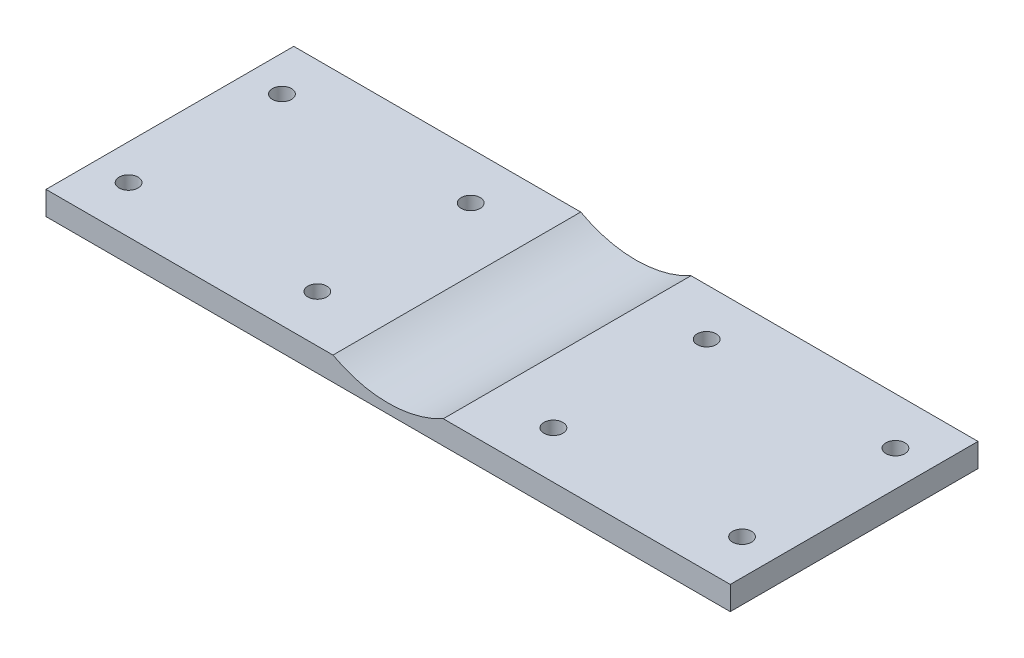
ISO-10303-21;
HEADER;
FILE_DESCRIPTION(('STEP AP214'),'2;1');
FILE_NAME('part.step','',(''),(''),'','','');
FILE_SCHEMA(('AUTOMOTIVE_DESIGN { 1 0 10303 214 1 1 1 1 }'));
ENDSEC;
DATA;
#1=APPLICATION_CONTEXT('core data for automotive mechanical design processes');
#2=APPLICATION_PROTOCOL_DEFINITION('international standard','automotive_design',2000,#1);
#3=PRODUCT_CONTEXT('',#1,'mechanical');
#4=PRODUCT('Part','Part','',(#3));
#5=PRODUCT_RELATED_PRODUCT_CATEGORY('part','',(#4));
#6=PRODUCT_DEFINITION_FORMATION('','',#4);
#7=PRODUCT_DEFINITION_CONTEXT('part definition',#1,'design');
#8=PRODUCT_DEFINITION('design','',#6,#7);
#9=PRODUCT_DEFINITION_SHAPE('','',#8);
#10=(LENGTH_UNIT() NAMED_UNIT(*) SI_UNIT(.MILLI.,.METRE.));
#11=(NAMED_UNIT(*) PLANE_ANGLE_UNIT() SI_UNIT($,.RADIAN.));
#12=(NAMED_UNIT(*) SI_UNIT($,.STERADIAN.) SOLID_ANGLE_UNIT());
#13=UNCERTAINTY_MEASURE_WITH_UNIT(LENGTH_MEASURE(1.E-05),#10,'distance_accuracy_value','');
#14=(GEOMETRIC_REPRESENTATION_CONTEXT(3) GLOBAL_UNCERTAINTY_ASSIGNED_CONTEXT((#13)) GLOBAL_UNIT_ASSIGNED_CONTEXT((#10,
#11,#12)) REPRESENTATION_CONTEXT('',''));
#15=CARTESIAN_POINT('',(0.,0.,0.));
#16=DIRECTION('',(0.,0.,1.));
#17=DIRECTION('',(1.,0.,0.));
#18=AXIS2_PLACEMENT_3D('',#15,#16,#17);
#19=CARTESIAN_POINT('',(0.,10.541,0.));
#20=DIRECTION('',(1.,0.,0.));
#21=DIRECTION('',(0.,0.,-1.));
#22=AXIS2_PLACEMENT_3D('',#19,#20,#21);
#23=PLANE('',#22);
#24=DIRECTION('',(0.,-1.,0.));
#25=VECTOR('',#24,1.);
#26=CARTESIAN_POINT('',(0.,10.541,0.));
#27=LINE('',#26,#25);
#28=CARTESIAN_POINT('',(0.,0.,0.));
#29=VERTEX_POINT('',#28);
#30=CARTESIAN_POINT('',(0.,-6.35,0.));
#31=VERTEX_POINT('',#30);
#32=EDGE_CURVE('E101',#29,#31,#27,.T.);
#33=ORIENTED_EDGE('',*,*,#32,.F.);
#34=DIRECTION('',(0.,0.,1.));
#35=VECTOR('',#34,1.);
#36=CARTESIAN_POINT('',(0.,0.,-66.675));
#37=LINE('',#36,#35);
#38=CARTESIAN_POINT('',(0.,0.,-66.675));
#39=VERTEX_POINT('',#38);
#40=EDGE_CURVE('E89',#39,#29,#37,.T.);
#41=ORIENTED_EDGE('',*,*,#40,.F.);
#42=DIRECTION('',(0.,-1.,0.));
#43=VECTOR('',#42,1.);
#44=CARTESIAN_POINT('',(0.,10.541,-66.675));
#45=LINE('',#44,#43);
#46=CARTESIAN_POINT('',(0.,-6.35,-66.675));
#47=VERTEX_POINT('',#46);
#48=EDGE_CURVE('E99',#39,#47,#45,.T.);
#49=ORIENTED_EDGE('',*,*,#48,.T.);
#50=DIRECTION('',(0.,0.,1.));
#51=VECTOR('',#50,1.);
#52=CARTESIAN_POINT('',(0.,-6.35,-66.675));
#53=LINE('',#52,#51);
#54=EDGE_CURVE('E95',#47,#31,#53,.T.);
#55=ORIENTED_EDGE('',*,*,#54,.T.);
#56=EDGE_LOOP('',(#33,#41,#49,#55));
#57=FACE_BOUND('',#56,.T.);
#58=ADVANCED_FACE('F36',(#57),#23,.F.);
#59=CARTESIAN_POINT('',(0.,10.541,0.));
#60=DIRECTION('',(0.,0.,-1.));
#61=DIRECTION('',(-1.,0.,0.));
#62=AXIS2_PLACEMENT_3D('',#59,#60,#61);
#63=PLANE('',#62);
#64=DIRECTION('',(0.,-1.,0.));
#65=VECTOR('',#64,1.);
#66=CARTESIAN_POINT('',(184.15,10.541,0.));
#67=LINE('',#66,#65);
#68=CARTESIAN_POINT('',(184.15,0.,0.));
#69=VERTEX_POINT('',#68);
#70=CARTESIAN_POINT('',(184.15,-6.34999999999999,0.));
#71=VERTEX_POINT('',#70);
#72=EDGE_CURVE('E110',#69,#71,#67,.T.);
#73=ORIENTED_EDGE('',*,*,#72,.F.);
#74=DIRECTION('',(1.,0.,0.));
#75=VECTOR('',#74,1.);
#76=CARTESIAN_POINT('',(65.0875,0.,0.));
#77=LINE('',#76,#75);
#78=CARTESIAN_POINT('',(106.914585251109,0.,0.));
#79=VERTEX_POINT('',#78);
#80=EDGE_CURVE('E190',#79,#69,#77,.T.);
#81=ORIENTED_EDGE('',*,*,#80,.F.);
#82=CARTESIAN_POINT('',(92.0749999999998,27.2393713169503,0.));
#83=DIRECTION('',(0.,0.,-1.));
#84=DIRECTION('',(-1.,0.,0.));
#85=AXIS2_PLACEMENT_3D('',#82,#83,#84);
#86=CIRCLE('',#85,31.0192946432962);
#87=CARTESIAN_POINT('',(77.2354147488908,0.,0.));
#88=VERTEX_POINT('',#87);
#89=EDGE_CURVE('E122',#79,#88,#86,.T.);
#90=ORIENTED_EDGE('',*,*,#89,.T.);
#91=EDGE_CURVE('E58',#29,#88,#77,.T.);
#92=ORIENTED_EDGE('',*,*,#91,.F.);
#93=ORIENTED_EDGE('',*,*,#32,.T.);
#94=DIRECTION('',(1.,0.,0.));
#95=VECTOR('',#94,1.);
#96=CARTESIAN_POINT('',(53.975,-6.35,0.));
#97=LINE('',#96,#95);
#98=EDGE_CURVE('E112',#31,#71,#97,.T.);
#99=ORIENTED_EDGE('',*,*,#98,.T.);
#100=EDGE_LOOP('',(#73,#81,#90,#92,#93,#99));
#101=FACE_BOUND('',#100,.T.);
#102=ADVANCED_FACE('F152',(#101),#63,.F.);
#103=CARTESIAN_POINT('',(184.15,10.541,0.));
#104=DIRECTION('',(-1.,0.,0.));
#105=DIRECTION('',(0.,0.,1.));
#106=AXIS2_PLACEMENT_3D('',#103,#104,#105);
#107=PLANE('',#106);
#108=DIRECTION('',(0.,-1.,0.));
#109=VECTOR('',#108,1.);
#110=CARTESIAN_POINT('',(184.15,10.541,-66.675));
#111=LINE('',#110,#109);
#112=CARTESIAN_POINT('',(184.15,0.,-66.675));
#113=VERTEX_POINT('',#112);
#114=CARTESIAN_POINT('',(184.15,-6.34999999999999,-66.675));
#115=VERTEX_POINT('',#114);
#116=EDGE_CURVE('E108',#113,#115,#111,.T.);
#117=ORIENTED_EDGE('',*,*,#116,.F.);
#118=DIRECTION('',(0.,0.,1.));
#119=VECTOR('',#118,1.);
#120=CARTESIAN_POINT('',(184.15,0.,-66.675));
#121=LINE('',#120,#119);
#122=EDGE_CURVE('E102',#113,#69,#121,.T.);
#123=ORIENTED_EDGE('',*,*,#122,.T.);
#124=ORIENTED_EDGE('',*,*,#72,.T.);
#125=DIRECTION('',(0.,0.,1.));
#126=VECTOR('',#125,1.);
#127=CARTESIAN_POINT('',(184.15,-6.34999999999999,-66.675));
#128=LINE('',#127,#126);
#129=EDGE_CURVE('E146',#115,#71,#128,.T.);
#130=ORIENTED_EDGE('',*,*,#129,.F.);
#131=EDGE_LOOP('',(#117,#123,#124,#130));
#132=FACE_BOUND('',#131,.T.);
#133=ADVANCED_FACE('F158',(#132),#107,.F.);
#134=CARTESIAN_POINT('',(0.,10.541,-66.675));
#135=DIRECTION('',(0.,0.,1.));
#136=DIRECTION('',(1.,0.,0.));
#137=AXIS2_PLACEMENT_3D('',#134,#135,#136);
#138=PLANE('',#137);
#139=ORIENTED_EDGE('',*,*,#48,.F.);
#140=DIRECTION('',(1.,0.,0.));
#141=VECTOR('',#140,1.);
#142=CARTESIAN_POINT('',(65.0875,0.,-66.675));
#143=LINE('',#142,#141);
#144=CARTESIAN_POINT('',(77.2354147488908,0.,-66.675));
#145=VERTEX_POINT('',#144);
#146=EDGE_CURVE('E85',#39,#145,#143,.T.);
#147=ORIENTED_EDGE('',*,*,#146,.T.);
#148=CARTESIAN_POINT('',(92.0749999999998,27.2393713169503,-66.675));
#149=DIRECTION('',(0.,0.,-1.));
#150=DIRECTION('',(-1.,0.,0.));
#151=AXIS2_PLACEMENT_3D('',#148,#149,#150);
#152=CIRCLE('',#151,31.0192946432962);
#153=CARTESIAN_POINT('',(106.914585251109,0.,-66.675));
#154=VERTEX_POINT('',#153);
#155=EDGE_CURVE('E120',#154,#145,#152,.T.);
#156=ORIENTED_EDGE('',*,*,#155,.F.);
#157=EDGE_CURVE('E50',#154,#113,#143,.T.);
#158=ORIENTED_EDGE('',*,*,#157,.T.);
#159=ORIENTED_EDGE('',*,*,#116,.T.);
#160=DIRECTION('',(-1.,0.,0.));
#161=VECTOR('',#160,1.);
#162=CARTESIAN_POINT('',(53.975,-6.35,-66.675));
#163=LINE('',#162,#161);
#164=EDGE_CURVE('E106',#115,#47,#163,.T.);
#165=ORIENTED_EDGE('',*,*,#164,.T.);
#166=EDGE_LOOP('',(#139,#147,#156,#158,#159,#165));
#167=FACE_BOUND('',#166,.T.);
#168=ADVANCED_FACE('F104',(#167),#138,.F.);
#169=CARTESIAN_POINT('',(53.975,-6.35,-143.139125575331));
#170=DIRECTION('',(0.,-1.,0.));
#171=DIRECTION('',(1.,0.,0.));
#172=AXIS2_PLACEMENT_3D('',#169,#170,#171);
#173=PLANE('',#172);
#174=CARTESIAN_POINT('',(9.525,-6.35,-12.7));
#175=DIRECTION('',(0.,1.,0.));
#176=DIRECTION('',(0.,0.,1.));
#177=AXIS2_PLACEMENT_3D('',#174,#175,#176);
#178=CIRCLE('',#177,2.5527);
#179=CARTESIAN_POINT('',(9.525,-6.35,-10.1473));
#180=VERTEX_POINT('',#179);
#181=EDGE_CURVE('E187',#180,#180,#178,.T.);
#182=ORIENTED_EDGE('',*,*,#181,.T.);
#183=EDGE_LOOP('',(#182));
#184=FACE_BOUND('',#183,.T.);
#185=CARTESIAN_POINT('',(9.52500000000001,-6.35,-53.975));
#186=DIRECTION('',(0.,1.,0.));
#187=DIRECTION('',(0.,0.,1.));
#188=AXIS2_PLACEMENT_3D('',#185,#186,#187);
#189=CIRCLE('',#188,2.5527);
#190=CARTESIAN_POINT('',(9.52500000000001,-6.35,-51.4223));
#191=VERTEX_POINT('',#190);
#192=EDGE_CURVE('E186',#191,#191,#189,.T.);
#193=ORIENTED_EDGE('',*,*,#192,.T.);
#194=EDGE_LOOP('',(#193));
#195=FACE_BOUND('',#194,.T.);
#196=CARTESIAN_POINT('',(60.325,-6.35,-12.7));
#197=DIRECTION('',(0.,1.,0.));
#198=DIRECTION('',(0.,0.,1.));
#199=AXIS2_PLACEMENT_3D('',#196,#197,#198);
#200=CIRCLE('',#199,2.5527);
#201=CARTESIAN_POINT('',(60.325,-6.35,-10.1473));
#202=VERTEX_POINT('',#201);
#203=EDGE_CURVE('E125',#202,#202,#200,.T.);
#204=ORIENTED_EDGE('',*,*,#203,.T.);
#205=EDGE_LOOP('',(#204));
#206=FACE_BOUND('',#205,.T.);
#207=CARTESIAN_POINT('',(60.325,-6.35,-53.975));
#208=DIRECTION('',(0.,1.,0.));
#209=DIRECTION('',(0.,0.,1.));
#210=AXIS2_PLACEMENT_3D('',#207,#208,#209);
#211=CIRCLE('',#210,2.55269999999999);
#212=CARTESIAN_POINT('',(60.325,-6.35,-51.4223));
#213=VERTEX_POINT('',#212);
#214=EDGE_CURVE('E131',#213,#213,#211,.T.);
#215=ORIENTED_EDGE('',*,*,#214,.T.);
#216=EDGE_LOOP('',(#215));
#217=FACE_BOUND('',#216,.T.);
#218=CARTESIAN_POINT('',(123.825,-6.35,-53.975));
#219=DIRECTION('',(0.,1.,0.));
#220=DIRECTION('',(0.,0.,1.));
#221=AXIS2_PLACEMENT_3D('',#218,#219,#220);
#222=CIRCLE('',#221,2.55270000000001);
#223=CARTESIAN_POINT('',(123.825,-6.35,-51.4223));
#224=VERTEX_POINT('',#223);
#225=EDGE_CURVE('E134',#224,#224,#222,.T.);
#226=ORIENTED_EDGE('',*,*,#225,.T.);
#227=EDGE_LOOP('',(#226));
#228=FACE_BOUND('',#227,.T.);
#229=CARTESIAN_POINT('',(123.849810746291,-6.35,-12.7));
#230=DIRECTION('',(0.,1.,0.));
#231=DIRECTION('',(0.,0.,1.));
#232=AXIS2_PLACEMENT_3D('',#229,#230,#231);
#233=CIRCLE('',#232,2.55270000000001);
#234=CARTESIAN_POINT('',(123.849810746291,-6.35,-10.1473));
#235=VERTEX_POINT('',#234);
#236=EDGE_CURVE('E137',#235,#235,#233,.T.);
#237=ORIENTED_EDGE('',*,*,#236,.T.);
#238=EDGE_LOOP('',(#237));
#239=FACE_BOUND('',#238,.T.);
#240=CARTESIAN_POINT('',(174.625,-6.35,-12.7));
#241=DIRECTION('',(0.,1.,0.));
#242=DIRECTION('',(0.,0.,1.));
#243=AXIS2_PLACEMENT_3D('',#240,#241,#242);
#244=CIRCLE('',#243,2.55269999999999);
#245=CARTESIAN_POINT('',(174.625,-6.35,-10.1473));
#246=VERTEX_POINT('',#245);
#247=EDGE_CURVE('E140',#246,#246,#244,.T.);
#248=ORIENTED_EDGE('',*,*,#247,.T.);
#249=EDGE_LOOP('',(#248));
#250=FACE_BOUND('',#249,.T.);
#251=CARTESIAN_POINT('',(174.625,-6.35,-53.975));
#252=DIRECTION('',(0.,1.,0.));
#253=DIRECTION('',(0.,0.,1.));
#254=AXIS2_PLACEMENT_3D('',#251,#252,#253);
#255=CIRCLE('',#254,2.55269999999999);
#256=CARTESIAN_POINT('',(174.625,-6.35,-51.4223));
#257=VERTEX_POINT('',#256);
#258=EDGE_CURVE('E143',#257,#257,#255,.T.);
#259=ORIENTED_EDGE('',*,*,#258,.T.);
#260=EDGE_LOOP('',(#259));
#261=FACE_BOUND('',#260,.T.);
#262=ORIENTED_EDGE('',*,*,#164,.F.);
#263=ORIENTED_EDGE('',*,*,#129,.T.);
#264=ORIENTED_EDGE('',*,*,#98,.F.);
#265=ORIENTED_EDGE('',*,*,#54,.F.);
#266=EDGE_LOOP('',(#262,#263,#264,#265));
#267=FACE_BOUND('',#266,.T.);
#268=ADVANCED_FACE('F155',(#184,#195,#206,#217,#228,#239,#250,#261,#267),#173,.T.);
#269=CARTESIAN_POINT('',(174.625,10.541,-53.975));
#270=DIRECTION('',(0.,1.,0.));
#271=DIRECTION('',(0.,0.,1.));
#272=AXIS2_PLACEMENT_3D('',#269,#270,#271);
#273=CYLINDRICAL_SURFACE('',#272,2.55269999999999);
#274=CARTESIAN_POINT('',(174.625,0.,-53.975));
#275=DIRECTION('',(0.,-1.,0.));
#276=DIRECTION('',(0.,0.,-1.));
#277=AXIS2_PLACEMENT_3D('',#274,#275,#276);
#278=CIRCLE('',#277,2.55269999999999);
#279=CARTESIAN_POINT('',(174.625,0.,-56.5277));
#280=VERTEX_POINT('',#279);
#281=EDGE_CURVE('E183',#280,#280,#278,.F.);
#282=ORIENTED_EDGE('',*,*,#281,.T.);
#283=EDGE_LOOP('',(#282));
#284=FACE_BOUND('',#283,.T.);
#285=ORIENTED_EDGE('',*,*,#258,.F.);
#286=EDGE_LOOP('',(#285));
#287=FACE_BOUND('',#286,.T.);
#288=ADVANCED_FACE('F205',(#284,#287),#273,.F.);
#289=CARTESIAN_POINT('',(174.625,10.541,-12.7));
#290=DIRECTION('',(0.,1.,0.));
#291=DIRECTION('',(0.,0.,1.));
#292=AXIS2_PLACEMENT_3D('',#289,#290,#291);
#293=CYLINDRICAL_SURFACE('',#292,2.55269999999999);
#294=CARTESIAN_POINT('',(174.625,0.,-12.7));
#295=DIRECTION('',(0.,-1.,0.));
#296=DIRECTION('',(0.,0.,-1.));
#297=AXIS2_PLACEMENT_3D('',#294,#295,#296);
#298=CIRCLE('',#297,2.55269999999999);
#299=CARTESIAN_POINT('',(174.625,0.,-15.2527));
#300=VERTEX_POINT('',#299);
#301=EDGE_CURVE('E180',#300,#300,#298,.F.);
#302=ORIENTED_EDGE('',*,*,#301,.T.);
#303=EDGE_LOOP('',(#302));
#304=FACE_BOUND('',#303,.T.);
#305=ORIENTED_EDGE('',*,*,#247,.F.);
#306=EDGE_LOOP('',(#305));
#307=FACE_BOUND('',#306,.T.);
#308=ADVANCED_FACE('F208',(#304,#307),#293,.F.);
#309=CARTESIAN_POINT('',(123.849810746291,10.541,-12.7));
#310=DIRECTION('',(0.,1.,0.));
#311=DIRECTION('',(0.,0.,1.));
#312=AXIS2_PLACEMENT_3D('',#309,#310,#311);
#313=CYLINDRICAL_SURFACE('',#312,2.55270000000001);
#314=CARTESIAN_POINT('',(123.849810746291,0.,-12.7));
#315=DIRECTION('',(0.,-1.,0.));
#316=DIRECTION('',(0.,0.,-1.));
#317=AXIS2_PLACEMENT_3D('',#314,#315,#316);
#318=CIRCLE('',#317,2.55270000000001);
#319=CARTESIAN_POINT('',(123.849810746291,0.,-15.2527));
#320=VERTEX_POINT('',#319);
#321=EDGE_CURVE('E177',#320,#320,#318,.F.);
#322=ORIENTED_EDGE('',*,*,#321,.T.);
#323=EDGE_LOOP('',(#322));
#324=FACE_BOUND('',#323,.T.);
#325=ORIENTED_EDGE('',*,*,#236,.F.);
#326=EDGE_LOOP('',(#325));
#327=FACE_BOUND('',#326,.T.);
#328=ADVANCED_FACE('F245',(#324,#327),#313,.F.);
#329=CARTESIAN_POINT('',(123.825,10.541,-53.975));
#330=DIRECTION('',(0.,1.,0.));
#331=DIRECTION('',(0.,0.,1.));
#332=AXIS2_PLACEMENT_3D('',#329,#330,#331);
#333=CYLINDRICAL_SURFACE('',#332,2.55270000000001);
#334=CARTESIAN_POINT('',(123.825,0.,-53.975));
#335=DIRECTION('',(0.,-1.,0.));
#336=DIRECTION('',(0.,0.,-1.));
#337=AXIS2_PLACEMENT_3D('',#334,#335,#336);
#338=CIRCLE('',#337,2.55270000000001);
#339=CARTESIAN_POINT('',(123.825,0.,-56.5277));
#340=VERTEX_POINT('',#339);
#341=EDGE_CURVE('E174',#340,#340,#338,.F.);
#342=ORIENTED_EDGE('',*,*,#341,.T.);
#343=EDGE_LOOP('',(#342));
#344=FACE_BOUND('',#343,.T.);
#345=ORIENTED_EDGE('',*,*,#225,.F.);
#346=EDGE_LOOP('',(#345));
#347=FACE_BOUND('',#346,.T.);
#348=ADVANCED_FACE('F253',(#344,#347),#333,.F.);
#349=CARTESIAN_POINT('',(60.325,10.541,-53.975));
#350=DIRECTION('',(0.,1.,0.));
#351=DIRECTION('',(0.,0.,1.));
#352=AXIS2_PLACEMENT_3D('',#349,#350,#351);
#353=CYLINDRICAL_SURFACE('',#352,2.5527);
#354=CARTESIAN_POINT('',(60.325,0.,-53.975));
#355=DIRECTION('',(0.,-1.,0.));
#356=DIRECTION('',(0.,0.,-1.));
#357=AXIS2_PLACEMENT_3D('',#354,#355,#356);
#358=CIRCLE('',#357,2.5527);
#359=CARTESIAN_POINT('',(60.325,0.,-56.5277));
#360=VERTEX_POINT('',#359);
#361=EDGE_CURVE('E171',#360,#360,#358,.F.);
#362=ORIENTED_EDGE('',*,*,#361,.T.);
#363=EDGE_LOOP('',(#362));
#364=FACE_BOUND('',#363,.T.);
#365=ORIENTED_EDGE('',*,*,#214,.F.);
#366=EDGE_LOOP('',(#365));
#367=FACE_BOUND('',#366,.T.);
#368=ADVANCED_FACE('F261',(#364,#367),#353,.F.);
#369=CARTESIAN_POINT('',(60.325,10.541,-12.7));
#370=DIRECTION('',(0.,1.,0.));
#371=DIRECTION('',(0.,0.,1.));
#372=AXIS2_PLACEMENT_3D('',#369,#370,#371);
#373=CYLINDRICAL_SURFACE('',#372,2.5527);
#374=CARTESIAN_POINT('',(60.325,0.,-12.7));
#375=DIRECTION('',(0.,-1.,0.));
#376=DIRECTION('',(0.,0.,-1.));
#377=AXIS2_PLACEMENT_3D('',#374,#375,#376);
#378=CIRCLE('',#377,2.5527);
#379=CARTESIAN_POINT('',(60.325,0.,-15.2527));
#380=VERTEX_POINT('',#379);
#381=EDGE_CURVE('E168',#380,#380,#378,.F.);
#382=ORIENTED_EDGE('',*,*,#381,.T.);
#383=EDGE_LOOP('',(#382));
#384=FACE_BOUND('',#383,.T.);
#385=ORIENTED_EDGE('',*,*,#203,.F.);
#386=EDGE_LOOP('',(#385));
#387=FACE_BOUND('',#386,.T.);
#388=ADVANCED_FACE('F269',(#384,#387),#373,.F.);
#389=CARTESIAN_POINT('',(9.525,10.541,-12.7));
#390=DIRECTION('',(0.,1.,0.));
#391=DIRECTION('',(0.,0.,1.));
#392=AXIS2_PLACEMENT_3D('',#389,#390,#391);
#393=CYLINDRICAL_SURFACE('',#392,2.5527);
#394=CARTESIAN_POINT('',(9.525,0.,-12.7));
#395=DIRECTION('',(0.,-1.,0.));
#396=DIRECTION('',(0.,0.,-1.));
#397=AXIS2_PLACEMENT_3D('',#394,#395,#396);
#398=CIRCLE('',#397,2.5527);
#399=CARTESIAN_POINT('',(9.525,0.,-15.2527));
#400=VERTEX_POINT('',#399);
#401=EDGE_CURVE('E163',#400,#400,#398,.F.);
#402=ORIENTED_EDGE('',*,*,#401,.T.);
#403=EDGE_LOOP('',(#402));
#404=FACE_BOUND('',#403,.T.);
#405=ORIENTED_EDGE('',*,*,#181,.F.);
#406=EDGE_LOOP('',(#405));
#407=FACE_BOUND('',#406,.T.);
#408=ADVANCED_FACE('F277',(#404,#407),#393,.F.);
#409=CARTESIAN_POINT('',(9.52500000000001,10.541,-53.975));
#410=DIRECTION('',(0.,1.,0.));
#411=DIRECTION('',(0.,0.,1.));
#412=AXIS2_PLACEMENT_3D('',#409,#410,#411);
#413=CYLINDRICAL_SURFACE('',#412,2.5527);
#414=CARTESIAN_POINT('',(9.52500000000001,0.,-53.975));
#415=DIRECTION('',(0.,-1.,0.));
#416=DIRECTION('',(0.,0.,-1.));
#417=AXIS2_PLACEMENT_3D('',#414,#415,#416);
#418=CIRCLE('',#417,2.5527);
#419=CARTESIAN_POINT('',(9.52500000000001,0.,-56.5277));
#420=VERTEX_POINT('',#419);
#421=EDGE_CURVE('E160',#420,#420,#418,.F.);
#422=ORIENTED_EDGE('',*,*,#421,.T.);
#423=EDGE_LOOP('',(#422));
#424=FACE_BOUND('',#423,.T.);
#425=ORIENTED_EDGE('',*,*,#192,.F.);
#426=EDGE_LOOP('',(#425));
#427=FACE_BOUND('',#426,.T.);
#428=ADVANCED_FACE('F286',(#424,#427),#413,.F.);
#429=CARTESIAN_POINT('',(92.0749999999998,27.2393713169503,0.));
#430=DIRECTION('',(0.,0.,-1.));
#431=DIRECTION('',(-1.,0.,0.));
#432=AXIS2_PLACEMENT_3D('',#429,#430,#431);
#433=CYLINDRICAL_SURFACE('',#432,31.0192946432962);
#434=ORIENTED_EDGE('',*,*,#155,.T.);
#435=DIRECTION('',(0.,0.,-1.));
#436=VECTOR('',#435,1.);
#437=CARTESIAN_POINT('',(77.2354147488908,0.,0.));
#438=LINE('',#437,#436);
#439=EDGE_CURVE('E11',#145,#88,#438,.F.);
#440=ORIENTED_EDGE('',*,*,#439,.T.);
#441=ORIENTED_EDGE('',*,*,#89,.F.);
#442=DIRECTION('',(0.,0.,-1.));
#443=VECTOR('',#442,1.);
#444=CARTESIAN_POINT('',(106.914585251109,0.,0.));
#445=LINE('',#444,#443);
#446=EDGE_CURVE('E43',#79,#154,#445,.T.);
#447=ORIENTED_EDGE('',*,*,#446,.T.);
#448=EDGE_LOOP('',(#434,#440,#441,#447));
#449=FACE_BOUND('',#448,.T.);
#450=ADVANCED_FACE('F119',(#449),#433,.F.);
#451=CARTESIAN_POINT('',(65.0875,0.,-66.675));
#452=DIRECTION('',(0.,-1.,0.));
#453=DIRECTION('',(0.,0.,-1.));
#454=AXIS2_PLACEMENT_3D('',#451,#452,#453);
#455=PLANE('',#454);
#456=ORIENTED_EDGE('',*,*,#80,.T.);
#457=ORIENTED_EDGE('',*,*,#122,.F.);
#458=ORIENTED_EDGE('',*,*,#157,.F.);
#459=ORIENTED_EDGE('',*,*,#446,.F.);
#460=EDGE_LOOP('',(#456,#457,#458,#459));
#461=FACE_BOUND('',#460,.T.);
#462=ORIENTED_EDGE('',*,*,#301,.F.);
#463=EDGE_LOOP('',(#462));
#464=FACE_BOUND('',#463,.T.);
#465=ORIENTED_EDGE('',*,*,#341,.F.);
#466=EDGE_LOOP('',(#465));
#467=FACE_BOUND('',#466,.T.);
#468=ORIENTED_EDGE('',*,*,#321,.F.);
#469=EDGE_LOOP('',(#468));
#470=FACE_BOUND('',#469,.T.);
#471=ORIENTED_EDGE('',*,*,#281,.F.);
#472=EDGE_LOOP('',(#471));
#473=FACE_BOUND('',#472,.T.);
#474=ADVANCED_FACE('F193',(#461,#464,#467,#470,#473),#455,.F.);
#475=ORIENTED_EDGE('',*,*,#146,.F.);
#476=ORIENTED_EDGE('',*,*,#40,.T.);
#477=ORIENTED_EDGE('',*,*,#91,.T.);
#478=ORIENTED_EDGE('',*,*,#439,.F.);
#479=EDGE_LOOP('',(#475,#476,#477,#478));
#480=FACE_BOUND('',#479,.T.);
#481=ORIENTED_EDGE('',*,*,#381,.F.);
#482=EDGE_LOOP('',(#481));
#483=FACE_BOUND('',#482,.T.);
#484=ORIENTED_EDGE('',*,*,#421,.F.);
#485=EDGE_LOOP('',(#484));
#486=FACE_BOUND('',#485,.T.);
#487=ORIENTED_EDGE('',*,*,#401,.F.);
#488=EDGE_LOOP('',(#487));
#489=FACE_BOUND('',#488,.T.);
#490=ORIENTED_EDGE('',*,*,#361,.F.);
#491=EDGE_LOOP('',(#490));
#492=FACE_BOUND('',#491,.T.);
#493=ADVANCED_FACE('F87',(#480,#483,#486,#489,#492),#455,.F.);
#494=CLOSED_SHELL('',(#58,#102,#133,#168,#268,#288,#308,#328,#348,#368,#388,#408,#428,#450,#474,#493));
#495=MANIFOLD_SOLID_BREP('B2',#494);
#496=ADVANCED_BREP_SHAPE_REPRESENTATION('',(#18,#495),#14);
#497=SHAPE_DEFINITION_REPRESENTATION(#9,#496);
ENDSEC;
END-ISO-10303-21;
